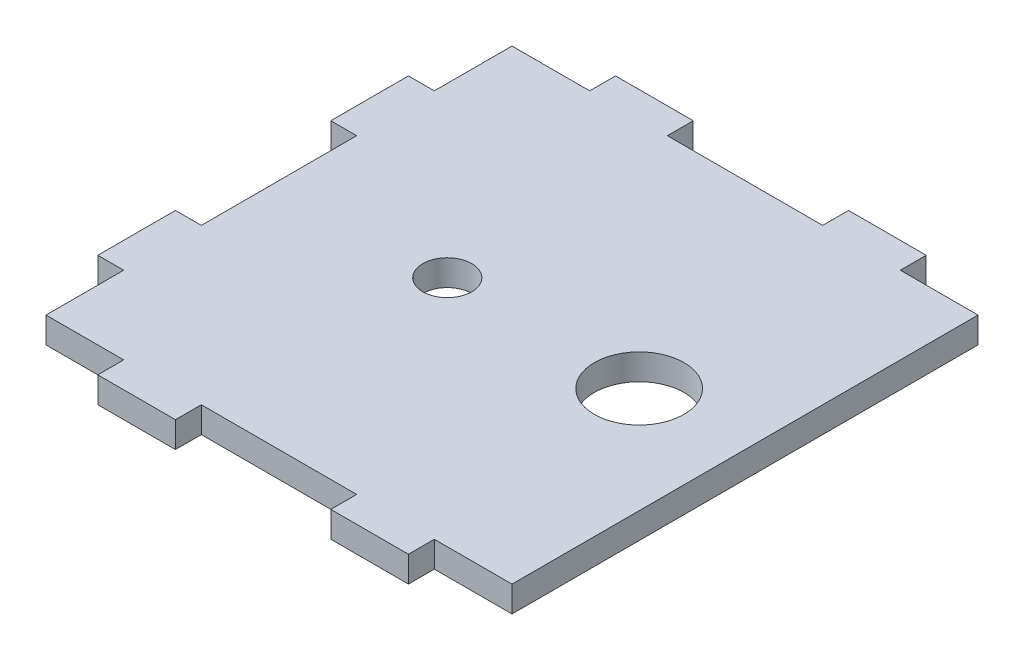
ISO-10303-21;
HEADER;
FILE_DESCRIPTION(('STEP AP214'),'2;1');
FILE_NAME('part.step','',(''),(''),'','','');
FILE_SCHEMA(('AUTOMOTIVE_DESIGN { 1 0 10303 214 1 1 1 1 }'));
ENDSEC;
DATA;
#1=APPLICATION_CONTEXT('core data for automotive mechanical design processes');
#2=APPLICATION_PROTOCOL_DEFINITION('international standard','automotive_design',2000,#1);
#3=PRODUCT_CONTEXT('',#1,'mechanical');
#4=PRODUCT('Part','Part','',(#3));
#5=PRODUCT_RELATED_PRODUCT_CATEGORY('part','',(#4));
#6=PRODUCT_DEFINITION_FORMATION('','',#4);
#7=PRODUCT_DEFINITION_CONTEXT('part definition',#1,'design');
#8=PRODUCT_DEFINITION('design','',#6,#7);
#9=PRODUCT_DEFINITION_SHAPE('','',#8);
#10=(LENGTH_UNIT() NAMED_UNIT(*) SI_UNIT(.MILLI.,.METRE.));
#11=(NAMED_UNIT(*) PLANE_ANGLE_UNIT() SI_UNIT($,.RADIAN.));
#12=(NAMED_UNIT(*) SI_UNIT($,.STERADIAN.) SOLID_ANGLE_UNIT());
#13=UNCERTAINTY_MEASURE_WITH_UNIT(LENGTH_MEASURE(1.E-05),#10,'distance_accuracy_value','');
#14=(GEOMETRIC_REPRESENTATION_CONTEXT(3) GLOBAL_UNCERTAINTY_ASSIGNED_CONTEXT((#13)) GLOBAL_UNIT_ASSIGNED_CONTEXT((#10,
#11,#12)) REPRESENTATION_CONTEXT('',''));
#15=CARTESIAN_POINT('',(0.,0.,0.));
#16=DIRECTION('',(0.,0.,1.));
#17=DIRECTION('',(1.,0.,0.));
#18=AXIS2_PLACEMENT_3D('',#15,#16,#17);
#19=CARTESIAN_POINT('',(0.,-6.35,0.));
#20=DIRECTION('',(-1.,0.,0.));
#21=DIRECTION('',(0.,0.,1.));
#22=AXIS2_PLACEMENT_3D('',#19,#20,#21);
#23=PLANE('',#22);
#24=DIRECTION('',(0.,0.,1.));
#25=VECTOR('',#24,1.);
#26=CARTESIAN_POINT('',(0.,0.,0.));
#27=LINE('',#26,#25);
#28=CARTESIAN_POINT('',(0.,0.,-19.05));
#29=VERTEX_POINT('',#28);
#30=CARTESIAN_POINT('',(0.,0.,0.));
#31=VERTEX_POINT('',#30);
#32=EDGE_CURVE('E262',#29,#31,#27,.T.);
#33=ORIENTED_EDGE('',*,*,#32,.F.);
#34=DIRECTION('',(0.,1.,0.));
#35=VECTOR('',#34,1.);
#36=CARTESIAN_POINT('',(0.,-6.35,-19.05));
#37=LINE('',#36,#35);
#38=CARTESIAN_POINT('',(0.,-6.35,-19.05));
#39=VERTEX_POINT('',#38);
#40=EDGE_CURVE('E11',#39,#29,#37,.T.);
#41=ORIENTED_EDGE('',*,*,#40,.F.);
#42=DIRECTION('',(0.,0.,1.));
#43=VECTOR('',#42,1.);
#44=CARTESIAN_POINT('',(0.,-6.35,0.));
#45=LINE('',#44,#43);
#46=CARTESIAN_POINT('',(0.,-6.35,0.));
#47=VERTEX_POINT('',#46);
#48=EDGE_CURVE('E343',#39,#47,#45,.T.);
#49=ORIENTED_EDGE('',*,*,#48,.T.);
#50=DIRECTION('',(0.,1.,0.));
#51=VECTOR('',#50,1.);
#52=CARTESIAN_POINT('',(0.,-6.35,0.));
#53=LINE('',#52,#51);
#54=EDGE_CURVE('E48',#47,#31,#53,.T.);
#55=ORIENTED_EDGE('',*,*,#54,.T.);
#56=EDGE_LOOP('',(#33,#41,#49,#55));
#57=FACE_BOUND('',#56,.T.);
#58=ADVANCED_FACE('F45',(#57),#23,.T.);
#59=CARTESIAN_POINT('',(0.,-6.35,-19.05));
#60=DIRECTION('',(0.,0.,1.));
#61=DIRECTION('',(1.,0.,0.));
#62=AXIS2_PLACEMENT_3D('',#59,#60,#61);
#63=PLANE('',#62);
#64=DIRECTION('',(1.,0.,0.));
#65=VECTOR('',#64,1.);
#66=CARTESIAN_POINT('',(0.,0.,-19.05));
#67=LINE('',#66,#65);
#68=CARTESIAN_POINT('',(-6.35000000000002,0.,-19.05));
#69=VERTEX_POINT('',#68);
#70=EDGE_CURVE('E341',#69,#29,#67,.T.);
#71=ORIENTED_EDGE('',*,*,#70,.F.);
#72=DIRECTION('',(0.,1.,0.));
#73=VECTOR('',#72,1.);
#74=CARTESIAN_POINT('',(-6.35000000000002,-6.35,-19.05));
#75=LINE('',#74,#73);
#76=CARTESIAN_POINT('',(-6.35000000000002,-6.35,-19.05));
#77=VERTEX_POINT('',#76);
#78=EDGE_CURVE('E54',#77,#69,#75,.T.);
#79=ORIENTED_EDGE('',*,*,#78,.F.);
#80=DIRECTION('',(1.,0.,0.));
#81=VECTOR('',#80,1.);
#82=CARTESIAN_POINT('',(0.,-6.35,-19.05));
#83=LINE('',#82,#81);
#84=EDGE_CURVE('E252',#77,#39,#83,.T.);
#85=ORIENTED_EDGE('',*,*,#84,.T.);
#86=ORIENTED_EDGE('',*,*,#40,.T.);
#87=EDGE_LOOP('',(#71,#79,#85,#86));
#88=FACE_BOUND('',#87,.T.);
#89=ADVANCED_FACE('F395',(#88),#63,.T.);
#90=CARTESIAN_POINT('',(-6.35000000000002,-6.35,-19.05));
#91=DIRECTION('',(-1.,0.,0.));
#92=DIRECTION('',(0.,0.,1.));
#93=AXIS2_PLACEMENT_3D('',#90,#91,#92);
#94=PLANE('',#93);
#95=DIRECTION('',(0.,0.,1.));
#96=VECTOR('',#95,1.);
#97=CARTESIAN_POINT('',(-6.35000000000002,0.,-19.05));
#98=LINE('',#97,#96);
#99=CARTESIAN_POINT('',(-6.35000000000002,0.,-38.1));
#100=VERTEX_POINT('',#99);
#101=EDGE_CURVE('E239',#100,#69,#98,.T.);
#102=ORIENTED_EDGE('',*,*,#101,.F.);
#103=DIRECTION('',(0.,1.,0.));
#104=VECTOR('',#103,1.);
#105=CARTESIAN_POINT('',(-6.35000000000002,-6.35,-38.1));
#106=LINE('',#105,#104);
#107=CARTESIAN_POINT('',(-6.35000000000002,-6.35,-38.1));
#108=VERTEX_POINT('',#107);
#109=EDGE_CURVE('E234',#108,#100,#106,.T.);
#110=ORIENTED_EDGE('',*,*,#109,.F.);
#111=DIRECTION('',(0.,0.,1.));
#112=VECTOR('',#111,1.);
#113=CARTESIAN_POINT('',(-6.35000000000002,-6.35,-19.05));
#114=LINE('',#113,#112);
#115=EDGE_CURVE('E237',#108,#77,#114,.T.);
#116=ORIENTED_EDGE('',*,*,#115,.T.);
#117=ORIENTED_EDGE('',*,*,#78,.T.);
#118=EDGE_LOOP('',(#102,#110,#116,#117));
#119=FACE_BOUND('',#118,.T.);
#120=ADVANCED_FACE('F236',(#119),#94,.T.);
#121=CARTESIAN_POINT('',(0.,-6.35,-38.1));
#122=DIRECTION('',(0.,0.,-1.));
#123=DIRECTION('',(-1.,0.,0.));
#124=AXIS2_PLACEMENT_3D('',#121,#122,#123);
#125=PLANE('',#124);
#126=DIRECTION('',(-1.,0.,0.));
#127=VECTOR('',#126,1.);
#128=CARTESIAN_POINT('',(0.,0.,-38.1));
#129=LINE('',#128,#127);
#130=CARTESIAN_POINT('',(0.,0.,-38.1));
#131=VERTEX_POINT('',#130);
#132=EDGE_CURVE('E338',#131,#100,#129,.T.);
#133=ORIENTED_EDGE('',*,*,#132,.F.);
#134=DIRECTION('',(0.,1.,0.));
#135=VECTOR('',#134,1.);
#136=CARTESIAN_POINT('',(0.,-6.35,-38.1));
#137=LINE('',#136,#135);
#138=CARTESIAN_POINT('',(0.,-6.35,-38.1));
#139=VERTEX_POINT('',#138);
#140=EDGE_CURVE('E244',#139,#131,#137,.T.);
#141=ORIENTED_EDGE('',*,*,#140,.F.);
#142=DIRECTION('',(-1.,0.,0.));
#143=VECTOR('',#142,1.);
#144=CARTESIAN_POINT('',(0.,-6.35,-38.1));
#145=LINE('',#144,#143);
#146=EDGE_CURVE('E250',#139,#108,#145,.T.);
#147=ORIENTED_EDGE('',*,*,#146,.T.);
#148=ORIENTED_EDGE('',*,*,#109,.T.);
#149=EDGE_LOOP('',(#133,#141,#147,#148));
#150=FACE_BOUND('',#149,.T.);
#151=ADVANCED_FACE('F254',(#150),#125,.T.);
#152=CARTESIAN_POINT('',(0.,-6.35,-38.1));
#153=DIRECTION('',(-1.,0.,0.));
#154=DIRECTION('',(0.,0.,1.));
#155=AXIS2_PLACEMENT_3D('',#152,#153,#154);
#156=PLANE('',#155);
#157=DIRECTION('',(0.,0.,1.));
#158=VECTOR('',#157,1.);
#159=CARTESIAN_POINT('',(0.,0.,-38.1));
#160=LINE('',#159,#158);
#161=CARTESIAN_POINT('',(0.,0.,-76.2));
#162=VERTEX_POINT('',#161);
#163=EDGE_CURVE('E335',#162,#131,#160,.T.);
#164=ORIENTED_EDGE('',*,*,#163,.F.);
#165=DIRECTION('',(0.,1.,0.));
#166=VECTOR('',#165,1.);
#167=CARTESIAN_POINT('',(0.,-6.35,-76.2));
#168=LINE('',#167,#166);
#169=CARTESIAN_POINT('',(0.,-6.35,-76.2));
#170=VERTEX_POINT('',#169);
#171=EDGE_CURVE('E347',#170,#162,#168,.T.);
#172=ORIENTED_EDGE('',*,*,#171,.F.);
#173=DIRECTION('',(0.,0.,1.));
#174=VECTOR('',#173,1.);
#175=CARTESIAN_POINT('',(0.,-6.35,-38.1));
#176=LINE('',#175,#174);
#177=EDGE_CURVE('E255',#170,#139,#176,.T.);
#178=ORIENTED_EDGE('',*,*,#177,.T.);
#179=ORIENTED_EDGE('',*,*,#140,.T.);
#180=EDGE_LOOP('',(#164,#172,#178,#179));
#181=FACE_BOUND('',#180,.T.);
#182=ADVANCED_FACE('F408',(#181),#156,.T.);
#183=CARTESIAN_POINT('',(0.,-6.35,-76.2));
#184=DIRECTION('',(0.,0.,1.));
#185=DIRECTION('',(1.,0.,0.));
#186=AXIS2_PLACEMENT_3D('',#183,#184,#185);
#187=PLANE('',#186);
#188=DIRECTION('',(1.,0.,0.));
#189=VECTOR('',#188,1.);
#190=CARTESIAN_POINT('',(0.,0.,-76.2));
#191=LINE('',#190,#189);
#192=CARTESIAN_POINT('',(-6.35000000000002,0.,-76.2));
#193=VERTEX_POINT('',#192);
#194=EDGE_CURVE('E332',#193,#162,#191,.T.);
#195=ORIENTED_EDGE('',*,*,#194,.F.);
#196=DIRECTION('',(0.,1.,0.));
#197=VECTOR('',#196,1.);
#198=CARTESIAN_POINT('',(-6.35000000000002,-6.35,-76.2));
#199=LINE('',#198,#197);
#200=CARTESIAN_POINT('',(-6.35000000000002,-6.35,-76.2));
#201=VERTEX_POINT('',#200);
#202=EDGE_CURVE('E349',#201,#193,#199,.T.);
#203=ORIENTED_EDGE('',*,*,#202,.F.);
#204=DIRECTION('',(1.,0.,0.));
#205=VECTOR('',#204,1.);
#206=CARTESIAN_POINT('',(0.,-6.35,-76.2));
#207=LINE('',#206,#205);
#208=EDGE_CURVE('E257',#201,#170,#207,.T.);
#209=ORIENTED_EDGE('',*,*,#208,.T.);
#210=ORIENTED_EDGE('',*,*,#171,.T.);
#211=EDGE_LOOP('',(#195,#203,#209,#210));
#212=FACE_BOUND('',#211,.T.);
#213=ADVANCED_FACE('F411',(#212),#187,.T.);
#214=CARTESIAN_POINT('',(-6.35000000000002,-6.35,-95.25));
#215=DIRECTION('',(-1.,0.,0.));
#216=DIRECTION('',(0.,0.,1.));
#217=AXIS2_PLACEMENT_3D('',#214,#215,#216);
#218=PLANE('',#217);
#219=DIRECTION('',(0.,0.,1.));
#220=VECTOR('',#219,1.);
#221=CARTESIAN_POINT('',(-6.35000000000002,0.,-95.25));
#222=LINE('',#221,#220);
#223=CARTESIAN_POINT('',(-6.35000000000002,0.,-95.25));
#224=VERTEX_POINT('',#223);
#225=EDGE_CURVE('E329',#224,#193,#222,.T.);
#226=ORIENTED_EDGE('',*,*,#225,.F.);
#227=DIRECTION('',(0.,1.,0.));
#228=VECTOR('',#227,1.);
#229=CARTESIAN_POINT('',(-6.35000000000002,-6.35,-95.25));
#230=LINE('',#229,#228);
#231=CARTESIAN_POINT('',(-6.35000000000002,-6.35,-95.25));
#232=VERTEX_POINT('',#231);
#233=EDGE_CURVE('E351',#232,#224,#230,.T.);
#234=ORIENTED_EDGE('',*,*,#233,.F.);
#235=DIRECTION('',(0.,0.,1.));
#236=VECTOR('',#235,1.);
#237=CARTESIAN_POINT('',(-6.35000000000002,-6.35,-95.25));
#238=LINE('',#237,#236);
#239=EDGE_CURVE('E597',#232,#201,#238,.T.);
#240=ORIENTED_EDGE('',*,*,#239,.T.);
#241=ORIENTED_EDGE('',*,*,#202,.T.);
#242=EDGE_LOOP('',(#226,#234,#240,#241));
#243=FACE_BOUND('',#242,.T.);
#244=ADVANCED_FACE('F415',(#243),#218,.T.);
#245=CARTESIAN_POINT('',(0.,-6.35,-95.25));
#246=DIRECTION('',(0.,0.,-1.));
#247=DIRECTION('',(-1.,0.,0.));
#248=AXIS2_PLACEMENT_3D('',#245,#246,#247);
#249=PLANE('',#248);
#250=DIRECTION('',(-1.,0.,0.));
#251=VECTOR('',#250,1.);
#252=CARTESIAN_POINT('',(0.,0.,-95.25));
#253=LINE('',#252,#251);
#254=CARTESIAN_POINT('',(0.,0.,-95.25));
#255=VERTEX_POINT('',#254);
#256=EDGE_CURVE('E326',#255,#224,#253,.T.);
#257=ORIENTED_EDGE('',*,*,#256,.F.);
#258=DIRECTION('',(0.,1.,0.));
#259=VECTOR('',#258,1.);
#260=CARTESIAN_POINT('',(0.,-6.35,-95.25));
#261=LINE('',#260,#259);
#262=CARTESIAN_POINT('',(0.,-6.35,-95.25));
#263=VERTEX_POINT('',#262);
#264=EDGE_CURVE('E353',#263,#255,#261,.T.);
#265=ORIENTED_EDGE('',*,*,#264,.F.);
#266=DIRECTION('',(-1.,0.,0.));
#267=VECTOR('',#266,1.);
#268=CARTESIAN_POINT('',(0.,-6.35,-95.25));
#269=LINE('',#268,#267);
#270=EDGE_CURVE('E594',#263,#232,#269,.T.);
#271=ORIENTED_EDGE('',*,*,#270,.T.);
#272=ORIENTED_EDGE('',*,*,#233,.T.);
#273=EDGE_LOOP('',(#257,#265,#271,#272));
#274=FACE_BOUND('',#273,.T.);
#275=ADVANCED_FACE('F419',(#274),#249,.T.);
#276=CARTESIAN_POINT('',(0.,-6.35,-95.25));
#277=DIRECTION('',(-1.,0.,0.));
#278=DIRECTION('',(0.,0.,1.));
#279=AXIS2_PLACEMENT_3D('',#276,#277,#278);
#280=PLANE('',#279);
#281=DIRECTION('',(0.,0.,1.));
#282=VECTOR('',#281,1.);
#283=CARTESIAN_POINT('',(0.,0.,-95.25));
#284=LINE('',#283,#282);
#285=CARTESIAN_POINT('',(0.,0.,-114.3));
#286=VERTEX_POINT('',#285);
#287=EDGE_CURVE('E323',#286,#255,#284,.T.);
#288=ORIENTED_EDGE('',*,*,#287,.F.);
#289=DIRECTION('',(0.,1.,0.));
#290=VECTOR('',#289,1.);
#291=CARTESIAN_POINT('',(0.,-6.35,-114.3));
#292=LINE('',#291,#290);
#293=CARTESIAN_POINT('',(0.,-6.35,-114.3));
#294=VERTEX_POINT('',#293);
#295=EDGE_CURVE('E355',#294,#286,#292,.T.);
#296=ORIENTED_EDGE('',*,*,#295,.F.);
#297=DIRECTION('',(0.,0.,1.));
#298=VECTOR('',#297,1.);
#299=CARTESIAN_POINT('',(0.,-6.35,-95.25));
#300=LINE('',#299,#298);
#301=EDGE_CURVE('E591',#294,#263,#300,.T.);
#302=ORIENTED_EDGE('',*,*,#301,.T.);
#303=ORIENTED_EDGE('',*,*,#264,.T.);
#304=EDGE_LOOP('',(#288,#296,#302,#303));
#305=FACE_BOUND('',#304,.T.);
#306=ADVANCED_FACE('F423',(#305),#280,.T.);
#307=CARTESIAN_POINT('',(0.,-6.35,-114.3));
#308=DIRECTION('',(0.,0.,-1.));
#309=DIRECTION('',(-1.,0.,0.));
#310=AXIS2_PLACEMENT_3D('',#307,#308,#309);
#311=PLANE('',#310);
#312=DIRECTION('',(-1.,0.,0.));
#313=VECTOR('',#312,1.);
#314=CARTESIAN_POINT('',(0.,0.,-114.3));
#315=LINE('',#314,#313);
#316=CARTESIAN_POINT('',(19.05,0.,-114.3));
#317=VERTEX_POINT('',#316);
#318=EDGE_CURVE('E320',#317,#286,#315,.T.);
#319=ORIENTED_EDGE('',*,*,#318,.F.);
#320=DIRECTION('',(0.,1.,0.));
#321=VECTOR('',#320,1.);
#322=CARTESIAN_POINT('',(19.05,-6.35,-114.3));
#323=LINE('',#322,#321);
#324=CARTESIAN_POINT('',(19.05,-6.35,-114.3));
#325=VERTEX_POINT('',#324);
#326=EDGE_CURVE('E357',#325,#317,#323,.T.);
#327=ORIENTED_EDGE('',*,*,#326,.F.);
#328=DIRECTION('',(-1.,0.,0.));
#329=VECTOR('',#328,1.);
#330=CARTESIAN_POINT('',(0.,-6.35,-114.3));
#331=LINE('',#330,#329);
#332=EDGE_CURVE('E588',#325,#294,#331,.T.);
#333=ORIENTED_EDGE('',*,*,#332,.T.);
#334=ORIENTED_EDGE('',*,*,#295,.T.);
#335=EDGE_LOOP('',(#319,#327,#333,#334));
#336=FACE_BOUND('',#335,.T.);
#337=ADVANCED_FACE('F427',(#336),#311,.T.);
#338=CARTESIAN_POINT('',(19.05,-6.35,-114.3));
#339=DIRECTION('',(-1.,0.,0.));
#340=DIRECTION('',(0.,0.,1.));
#341=AXIS2_PLACEMENT_3D('',#338,#339,#340);
#342=PLANE('',#341);
#343=DIRECTION('',(0.,0.,1.));
#344=VECTOR('',#343,1.);
#345=CARTESIAN_POINT('',(19.05,0.,-114.3));
#346=LINE('',#345,#344);
#347=CARTESIAN_POINT('',(19.05,0.,-120.65));
#348=VERTEX_POINT('',#347);
#349=EDGE_CURVE('E317',#348,#317,#346,.T.);
#350=ORIENTED_EDGE('',*,*,#349,.F.);
#351=DIRECTION('',(0.,1.,0.));
#352=VECTOR('',#351,1.);
#353=CARTESIAN_POINT('',(19.05,-6.35,-120.65));
#354=LINE('',#353,#352);
#355=CARTESIAN_POINT('',(19.05,-6.35,-120.65));
#356=VERTEX_POINT('',#355);
#357=EDGE_CURVE('E359',#356,#348,#354,.T.);
#358=ORIENTED_EDGE('',*,*,#357,.F.);
#359=DIRECTION('',(0.,0.,1.));
#360=VECTOR('',#359,1.);
#361=CARTESIAN_POINT('',(19.05,-6.35,-114.3));
#362=LINE('',#361,#360);
#363=EDGE_CURVE('E585',#356,#325,#362,.T.);
#364=ORIENTED_EDGE('',*,*,#363,.T.);
#365=ORIENTED_EDGE('',*,*,#326,.T.);
#366=EDGE_LOOP('',(#350,#358,#364,#365));
#367=FACE_BOUND('',#366,.T.);
#368=ADVANCED_FACE('F431',(#367),#342,.T.);
#369=CARTESIAN_POINT('',(19.05,-6.35,-120.65));
#370=DIRECTION('',(0.,0.,-1.));
#371=DIRECTION('',(-1.,0.,0.));
#372=AXIS2_PLACEMENT_3D('',#369,#370,#371);
#373=PLANE('',#372);
#374=DIRECTION('',(-1.,0.,0.));
#375=VECTOR('',#374,1.);
#376=CARTESIAN_POINT('',(19.05,0.,-120.65));
#377=LINE('',#376,#375);
#378=CARTESIAN_POINT('',(38.1,0.,-120.65));
#379=VERTEX_POINT('',#378);
#380=EDGE_CURVE('E314',#379,#348,#377,.T.);
#381=ORIENTED_EDGE('',*,*,#380,.F.);
#382=DIRECTION('',(0.,1.,0.));
#383=VECTOR('',#382,1.);
#384=CARTESIAN_POINT('',(38.1,-6.35,-120.65));
#385=LINE('',#384,#383);
#386=CARTESIAN_POINT('',(38.1,-6.35,-120.65));
#387=VERTEX_POINT('',#386);
#388=EDGE_CURVE('E361',#387,#379,#385,.T.);
#389=ORIENTED_EDGE('',*,*,#388,.F.);
#390=DIRECTION('',(-1.,0.,0.));
#391=VECTOR('',#390,1.);
#392=CARTESIAN_POINT('',(19.05,-6.35,-120.65));
#393=LINE('',#392,#391);
#394=EDGE_CURVE('E582',#387,#356,#393,.T.);
#395=ORIENTED_EDGE('',*,*,#394,.T.);
#396=ORIENTED_EDGE('',*,*,#357,.T.);
#397=EDGE_LOOP('',(#381,#389,#395,#396));
#398=FACE_BOUND('',#397,.T.);
#399=ADVANCED_FACE('F435',(#398),#373,.T.);
#400=CARTESIAN_POINT('',(38.1,-6.35,-114.3));
#401=DIRECTION('',(1.,0.,0.));
#402=DIRECTION('',(0.,0.,-1.));
#403=AXIS2_PLACEMENT_3D('',#400,#401,#402);
#404=PLANE('',#403);
#405=DIRECTION('',(0.,0.,-1.));
#406=VECTOR('',#405,1.);
#407=CARTESIAN_POINT('',(38.1,0.,-114.3));
#408=LINE('',#407,#406);
#409=CARTESIAN_POINT('',(38.1,0.,-114.3));
#410=VERTEX_POINT('',#409);
#411=EDGE_CURVE('E311',#410,#379,#408,.T.);
#412=ORIENTED_EDGE('',*,*,#411,.F.);
#413=DIRECTION('',(0.,1.,0.));
#414=VECTOR('',#413,1.);
#415=CARTESIAN_POINT('',(38.1,-6.35,-114.3));
#416=LINE('',#415,#414);
#417=CARTESIAN_POINT('',(38.1,-6.35,-114.3));
#418=VERTEX_POINT('',#417);
#419=EDGE_CURVE('E363',#418,#410,#416,.T.);
#420=ORIENTED_EDGE('',*,*,#419,.F.);
#421=DIRECTION('',(0.,0.,-1.));
#422=VECTOR('',#421,1.);
#423=CARTESIAN_POINT('',(38.1,-6.35,-114.3));
#424=LINE('',#423,#422);
#425=EDGE_CURVE('E579',#418,#387,#424,.T.);
#426=ORIENTED_EDGE('',*,*,#425,.T.);
#427=ORIENTED_EDGE('',*,*,#388,.T.);
#428=EDGE_LOOP('',(#412,#420,#426,#427));
#429=FACE_BOUND('',#428,.T.);
#430=ADVANCED_FACE('F439',(#429),#404,.T.);
#431=CARTESIAN_POINT('',(38.1,-6.35,-114.3));
#432=DIRECTION('',(0.,0.,-1.));
#433=DIRECTION('',(-1.,0.,0.));
#434=AXIS2_PLACEMENT_3D('',#431,#432,#433);
#435=PLANE('',#434);
#436=DIRECTION('',(-1.,0.,0.));
#437=VECTOR('',#436,1.);
#438=CARTESIAN_POINT('',(38.1,0.,-114.3));
#439=LINE('',#438,#437);
#440=CARTESIAN_POINT('',(76.2,0.,-114.3));
#441=VERTEX_POINT('',#440);
#442=EDGE_CURVE('E308',#441,#410,#439,.T.);
#443=ORIENTED_EDGE('',*,*,#442,.F.);
#444=DIRECTION('',(0.,1.,0.));
#445=VECTOR('',#444,1.);
#446=CARTESIAN_POINT('',(76.2,-6.35,-114.3));
#447=LINE('',#446,#445);
#448=CARTESIAN_POINT('',(76.2,-6.35,-114.3));
#449=VERTEX_POINT('',#448);
#450=EDGE_CURVE('E365',#449,#441,#447,.T.);
#451=ORIENTED_EDGE('',*,*,#450,.F.);
#452=DIRECTION('',(-1.,0.,0.));
#453=VECTOR('',#452,1.);
#454=CARTESIAN_POINT('',(38.1,-6.35,-114.3));
#455=LINE('',#454,#453);
#456=EDGE_CURVE('E576',#449,#418,#455,.T.);
#457=ORIENTED_EDGE('',*,*,#456,.T.);
#458=ORIENTED_EDGE('',*,*,#419,.T.);
#459=EDGE_LOOP('',(#443,#451,#457,#458));
#460=FACE_BOUND('',#459,.T.);
#461=ADVANCED_FACE('F443',(#460),#435,.T.);
#462=CARTESIAN_POINT('',(76.2,-6.35,-114.3));
#463=DIRECTION('',(-1.,0.,0.));
#464=DIRECTION('',(0.,0.,1.));
#465=AXIS2_PLACEMENT_3D('',#462,#463,#464);
#466=PLANE('',#465);
#467=DIRECTION('',(0.,0.,1.));
#468=VECTOR('',#467,1.);
#469=CARTESIAN_POINT('',(76.2,0.,-114.3));
#470=LINE('',#469,#468);
#471=CARTESIAN_POINT('',(76.2,0.,-120.65));
#472=VERTEX_POINT('',#471);
#473=EDGE_CURVE('E305',#472,#441,#470,.T.);
#474=ORIENTED_EDGE('',*,*,#473,.F.);
#475=DIRECTION('',(0.,1.,0.));
#476=VECTOR('',#475,1.);
#477=CARTESIAN_POINT('',(76.2,-6.35,-120.65));
#478=LINE('',#477,#476);
#479=CARTESIAN_POINT('',(76.2,-6.35,-120.65));
#480=VERTEX_POINT('',#479);
#481=EDGE_CURVE('E367',#480,#472,#478,.T.);
#482=ORIENTED_EDGE('',*,*,#481,.F.);
#483=DIRECTION('',(0.,0.,1.));
#484=VECTOR('',#483,1.);
#485=CARTESIAN_POINT('',(76.2,-6.35,-114.3));
#486=LINE('',#485,#484);
#487=EDGE_CURVE('E573',#480,#449,#486,.T.);
#488=ORIENTED_EDGE('',*,*,#487,.T.);
#489=ORIENTED_EDGE('',*,*,#450,.T.);
#490=EDGE_LOOP('',(#474,#482,#488,#489));
#491=FACE_BOUND('',#490,.T.);
#492=ADVANCED_FACE('F447',(#491),#466,.T.);
#493=CARTESIAN_POINT('',(95.25,-6.35,-120.65));
#494=DIRECTION('',(0.,0.,-1.));
#495=DIRECTION('',(-1.,0.,0.));
#496=AXIS2_PLACEMENT_3D('',#493,#494,#495);
#497=PLANE('',#496);
#498=DIRECTION('',(-1.,0.,0.));
#499=VECTOR('',#498,1.);
#500=CARTESIAN_POINT('',(95.25,0.,-120.65));
#501=LINE('',#500,#499);
#502=CARTESIAN_POINT('',(95.25,0.,-120.65));
#503=VERTEX_POINT('',#502);
#504=EDGE_CURVE('E302',#503,#472,#501,.T.);
#505=ORIENTED_EDGE('',*,*,#504,.F.);
#506=DIRECTION('',(0.,1.,0.));
#507=VECTOR('',#506,1.);
#508=CARTESIAN_POINT('',(95.25,-6.35,-120.65));
#509=LINE('',#508,#507);
#510=CARTESIAN_POINT('',(95.25,-6.35,-120.65));
#511=VERTEX_POINT('',#510);
#512=EDGE_CURVE('E369',#511,#503,#509,.T.);
#513=ORIENTED_EDGE('',*,*,#512,.F.);
#514=DIRECTION('',(-1.,0.,0.));
#515=VECTOR('',#514,1.);
#516=CARTESIAN_POINT('',(95.25,-6.35,-120.65));
#517=LINE('',#516,#515);
#518=EDGE_CURVE('E570',#511,#480,#517,.T.);
#519=ORIENTED_EDGE('',*,*,#518,.T.);
#520=ORIENTED_EDGE('',*,*,#481,.T.);
#521=EDGE_LOOP('',(#505,#513,#519,#520));
#522=FACE_BOUND('',#521,.T.);
#523=ADVANCED_FACE('F451',(#522),#497,.T.);
#524=CARTESIAN_POINT('',(95.25,-6.35,-114.3));
#525=DIRECTION('',(1.,0.,0.));
#526=DIRECTION('',(0.,0.,-1.));
#527=AXIS2_PLACEMENT_3D('',#524,#525,#526);
#528=PLANE('',#527);
#529=DIRECTION('',(0.,0.,-1.));
#530=VECTOR('',#529,1.);
#531=CARTESIAN_POINT('',(95.25,0.,-114.3));
#532=LINE('',#531,#530);
#533=CARTESIAN_POINT('',(95.25,0.,-114.3));
#534=VERTEX_POINT('',#533);
#535=EDGE_CURVE('E299',#534,#503,#532,.T.);
#536=ORIENTED_EDGE('',*,*,#535,.F.);
#537=DIRECTION('',(0.,1.,0.));
#538=VECTOR('',#537,1.);
#539=CARTESIAN_POINT('',(95.25,-6.35,-114.3));
#540=LINE('',#539,#538);
#541=CARTESIAN_POINT('',(95.25,-6.35,-114.3));
#542=VERTEX_POINT('',#541);
#543=EDGE_CURVE('E371',#542,#534,#540,.T.);
#544=ORIENTED_EDGE('',*,*,#543,.F.);
#545=DIRECTION('',(0.,0.,-1.));
#546=VECTOR('',#545,1.);
#547=CARTESIAN_POINT('',(95.25,-6.35,-114.3));
#548=LINE('',#547,#546);
#549=EDGE_CURVE('E567',#542,#511,#548,.T.);
#550=ORIENTED_EDGE('',*,*,#549,.T.);
#551=ORIENTED_EDGE('',*,*,#512,.T.);
#552=EDGE_LOOP('',(#536,#544,#550,#551));
#553=FACE_BOUND('',#552,.T.);
#554=ADVANCED_FACE('F455',(#553),#528,.T.);
#555=CARTESIAN_POINT('',(95.25,-6.35,-114.3));
#556=DIRECTION('',(0.,0.,-1.));
#557=DIRECTION('',(-1.,0.,0.));
#558=AXIS2_PLACEMENT_3D('',#555,#556,#557);
#559=PLANE('',#558);
#560=DIRECTION('',(-1.,0.,0.));
#561=VECTOR('',#560,1.);
#562=CARTESIAN_POINT('',(95.25,0.,-114.3));
#563=LINE('',#562,#561);
#564=CARTESIAN_POINT('',(114.3,0.,-114.3));
#565=VERTEX_POINT('',#564);
#566=EDGE_CURVE('E296',#565,#534,#563,.T.);
#567=ORIENTED_EDGE('',*,*,#566,.F.);
#568=DIRECTION('',(0.,1.,0.));
#569=VECTOR('',#568,1.);
#570=CARTESIAN_POINT('',(114.3,-6.35,-114.3));
#571=LINE('',#570,#569);
#572=CARTESIAN_POINT('',(114.3,-6.35,-114.3));
#573=VERTEX_POINT('',#572);
#574=EDGE_CURVE('E373',#573,#565,#571,.T.);
#575=ORIENTED_EDGE('',*,*,#574,.F.);
#576=DIRECTION('',(-1.,0.,0.));
#577=VECTOR('',#576,1.);
#578=CARTESIAN_POINT('',(95.25,-6.35,-114.3));
#579=LINE('',#578,#577);
#580=EDGE_CURVE('E564',#573,#542,#579,.T.);
#581=ORIENTED_EDGE('',*,*,#580,.T.);
#582=ORIENTED_EDGE('',*,*,#543,.T.);
#583=EDGE_LOOP('',(#567,#575,#581,#582));
#584=FACE_BOUND('',#583,.T.);
#585=ADVANCED_FACE('F459',(#584),#559,.T.);
#586=CARTESIAN_POINT('',(114.3,-6.35,0.));
#587=DIRECTION('',(1.,0.,0.));
#588=DIRECTION('',(0.,0.,-1.));
#589=AXIS2_PLACEMENT_3D('',#586,#587,#588);
#590=PLANE('',#589);
#591=DIRECTION('',(0.,0.,-1.));
#592=VECTOR('',#591,1.);
#593=CARTESIAN_POINT('',(114.3,0.,0.));
#594=LINE('',#593,#592);
#595=CARTESIAN_POINT('',(114.3,0.,0.));
#596=VERTEX_POINT('',#595);
#597=EDGE_CURVE('E293',#596,#565,#594,.T.);
#598=ORIENTED_EDGE('',*,*,#597,.F.);
#599=DIRECTION('',(0.,1.,0.));
#600=VECTOR('',#599,1.);
#601=CARTESIAN_POINT('',(114.3,-6.35,0.));
#602=LINE('',#601,#600);
#603=CARTESIAN_POINT('',(114.3,-6.35,0.));
#604=VERTEX_POINT('',#603);
#605=EDGE_CURVE('E375',#604,#596,#602,.T.);
#606=ORIENTED_EDGE('',*,*,#605,.F.);
#607=DIRECTION('',(0.,0.,-1.));
#608=VECTOR('',#607,1.);
#609=CARTESIAN_POINT('',(114.3,-6.35,0.));
#610=LINE('',#609,#608);
#611=EDGE_CURVE('E561',#604,#573,#610,.T.);
#612=ORIENTED_EDGE('',*,*,#611,.T.);
#613=ORIENTED_EDGE('',*,*,#574,.T.);
#614=EDGE_LOOP('',(#598,#606,#612,#613));
#615=FACE_BOUND('',#614,.T.);
#616=ADVANCED_FACE('F463',(#615),#590,.T.);
#617=CARTESIAN_POINT('',(95.25,-6.35,0.));
#618=DIRECTION('',(0.,0.,1.));
#619=DIRECTION('',(1.,0.,0.));
#620=AXIS2_PLACEMENT_3D('',#617,#618,#619);
#621=PLANE('',#620);
#622=DIRECTION('',(1.,0.,0.));
#623=VECTOR('',#622,1.);
#624=CARTESIAN_POINT('',(95.25,0.,0.));
#625=LINE('',#624,#623);
#626=CARTESIAN_POINT('',(95.25,0.,0.));
#627=VERTEX_POINT('',#626);
#628=EDGE_CURVE('E290',#627,#596,#625,.T.);
#629=ORIENTED_EDGE('',*,*,#628,.F.);
#630=DIRECTION('',(0.,1.,0.));
#631=VECTOR('',#630,1.);
#632=CARTESIAN_POINT('',(95.25,-6.35,0.));
#633=LINE('',#632,#631);
#634=CARTESIAN_POINT('',(95.25,-6.35,0.));
#635=VERTEX_POINT('',#634);
#636=EDGE_CURVE('E377',#635,#627,#633,.T.);
#637=ORIENTED_EDGE('',*,*,#636,.F.);
#638=DIRECTION('',(1.,0.,0.));
#639=VECTOR('',#638,1.);
#640=CARTESIAN_POINT('',(95.25,-6.35,0.));
#641=LINE('',#640,#639);
#642=EDGE_CURVE('E558',#635,#604,#641,.T.);
#643=ORIENTED_EDGE('',*,*,#642,.T.);
#644=ORIENTED_EDGE('',*,*,#605,.T.);
#645=EDGE_LOOP('',(#629,#637,#643,#644));
#646=FACE_BOUND('',#645,.T.);
#647=ADVANCED_FACE('F467',(#646),#621,.T.);
#648=CARTESIAN_POINT('',(95.25,-6.35,0.));
#649=DIRECTION('',(1.,0.,0.));
#650=DIRECTION('',(0.,0.,-1.));
#651=AXIS2_PLACEMENT_3D('',#648,#649,#650);
#652=PLANE('',#651);
#653=DIRECTION('',(0.,0.,-1.));
#654=VECTOR('',#653,1.);
#655=CARTESIAN_POINT('',(95.25,0.,0.));
#656=LINE('',#655,#654);
#657=CARTESIAN_POINT('',(95.25,0.,6.34999999999999));
#658=VERTEX_POINT('',#657);
#659=EDGE_CURVE('E287',#658,#627,#656,.T.);
#660=ORIENTED_EDGE('',*,*,#659,.F.);
#661=DIRECTION('',(0.,1.,0.));
#662=VECTOR('',#661,1.);
#663=CARTESIAN_POINT('',(95.25,-6.35,6.34999999999999));
#664=LINE('',#663,#662);
#665=CARTESIAN_POINT('',(95.25,-6.35,6.34999999999999));
#666=VERTEX_POINT('',#665);
#667=EDGE_CURVE('E379',#666,#658,#664,.T.);
#668=ORIENTED_EDGE('',*,*,#667,.F.);
#669=DIRECTION('',(0.,0.,-1.));
#670=VECTOR('',#669,1.);
#671=CARTESIAN_POINT('',(95.25,-6.35,0.));
#672=LINE('',#671,#670);
#673=EDGE_CURVE('E555',#666,#635,#672,.T.);
#674=ORIENTED_EDGE('',*,*,#673,.T.);
#675=ORIENTED_EDGE('',*,*,#636,.T.);
#676=EDGE_LOOP('',(#660,#668,#674,#675));
#677=FACE_BOUND('',#676,.T.);
#678=ADVANCED_FACE('F471',(#677),#652,.T.);
#679=CARTESIAN_POINT('',(95.25,-6.35,6.34999999999999));
#680=DIRECTION('',(0.,0.,1.));
#681=DIRECTION('',(1.,0.,0.));
#682=AXIS2_PLACEMENT_3D('',#679,#680,#681);
#683=PLANE('',#682);
#684=DIRECTION('',(1.,0.,0.));
#685=VECTOR('',#684,1.);
#686=CARTESIAN_POINT('',(95.25,0.,6.34999999999999));
#687=LINE('',#686,#685);
#688=CARTESIAN_POINT('',(76.2,0.,6.35));
#689=VERTEX_POINT('',#688);
#690=EDGE_CURVE('E284',#689,#658,#687,.T.);
#691=ORIENTED_EDGE('',*,*,#690,.F.);
#692=DIRECTION('',(0.,1.,0.));
#693=VECTOR('',#692,1.);
#694=CARTESIAN_POINT('',(76.2,-6.35,6.35));
#695=LINE('',#694,#693);
#696=CARTESIAN_POINT('',(76.2,-6.35,6.35));
#697=VERTEX_POINT('',#696);
#698=EDGE_CURVE('E381',#697,#689,#695,.T.);
#699=ORIENTED_EDGE('',*,*,#698,.F.);
#700=DIRECTION('',(1.,0.,0.));
#701=VECTOR('',#700,1.);
#702=CARTESIAN_POINT('',(95.25,-6.35,6.34999999999999));
#703=LINE('',#702,#701);
#704=EDGE_CURVE('E552',#697,#666,#703,.T.);
#705=ORIENTED_EDGE('',*,*,#704,.T.);
#706=ORIENTED_EDGE('',*,*,#667,.T.);
#707=EDGE_LOOP('',(#691,#699,#705,#706));
#708=FACE_BOUND('',#707,.T.);
#709=ADVANCED_FACE('F475',(#708),#683,.T.);
#710=CARTESIAN_POINT('',(76.2,-6.35,0.));
#711=DIRECTION('',(-1.,0.,0.));
#712=DIRECTION('',(0.,0.,1.));
#713=AXIS2_PLACEMENT_3D('',#710,#711,#712);
#714=PLANE('',#713);
#715=DIRECTION('',(0.,0.,1.));
#716=VECTOR('',#715,1.);
#717=CARTESIAN_POINT('',(76.2,0.,0.));
#718=LINE('',#717,#716);
#719=CARTESIAN_POINT('',(76.2,0.,0.));
#720=VERTEX_POINT('',#719);
#721=EDGE_CURVE('E281',#720,#689,#718,.T.);
#722=ORIENTED_EDGE('',*,*,#721,.F.);
#723=DIRECTION('',(0.,1.,0.));
#724=VECTOR('',#723,1.);
#725=CARTESIAN_POINT('',(76.2,-6.35,0.));
#726=LINE('',#725,#724);
#727=CARTESIAN_POINT('',(76.2,-6.35,0.));
#728=VERTEX_POINT('',#727);
#729=EDGE_CURVE('E383',#728,#720,#726,.T.);
#730=ORIENTED_EDGE('',*,*,#729,.F.);
#731=DIRECTION('',(0.,0.,1.));
#732=VECTOR('',#731,1.);
#733=CARTESIAN_POINT('',(76.2,-6.35,0.));
#734=LINE('',#733,#732);
#735=EDGE_CURVE('E549',#728,#697,#734,.T.);
#736=ORIENTED_EDGE('',*,*,#735,.T.);
#737=ORIENTED_EDGE('',*,*,#698,.T.);
#738=EDGE_LOOP('',(#722,#730,#736,#737));
#739=FACE_BOUND('',#738,.T.);
#740=ADVANCED_FACE('F479',(#739),#714,.T.);
#741=CARTESIAN_POINT('',(38.1,-6.35,0.));
#742=DIRECTION('',(0.,0.,1.));
#743=DIRECTION('',(1.,0.,0.));
#744=AXIS2_PLACEMENT_3D('',#741,#742,#743);
#745=PLANE('',#744);
#746=DIRECTION('',(1.,0.,0.));
#747=VECTOR('',#746,1.);
#748=CARTESIAN_POINT('',(38.1,0.,0.));
#749=LINE('',#748,#747);
#750=CARTESIAN_POINT('',(38.1,0.,0.));
#751=VERTEX_POINT('',#750);
#752=EDGE_CURVE('E278',#751,#720,#749,.T.);
#753=ORIENTED_EDGE('',*,*,#752,.F.);
#754=DIRECTION('',(0.,1.,0.));
#755=VECTOR('',#754,1.);
#756=CARTESIAN_POINT('',(38.1,-6.35,0.));
#757=LINE('',#756,#755);
#758=CARTESIAN_POINT('',(38.1,-6.35,0.));
#759=VERTEX_POINT('',#758);
#760=EDGE_CURVE('E385',#759,#751,#757,.T.);
#761=ORIENTED_EDGE('',*,*,#760,.F.);
#762=DIRECTION('',(1.,0.,0.));
#763=VECTOR('',#762,1.);
#764=CARTESIAN_POINT('',(38.1,-6.35,0.));
#765=LINE('',#764,#763);
#766=EDGE_CURVE('E546',#759,#728,#765,.T.);
#767=ORIENTED_EDGE('',*,*,#766,.T.);
#768=ORIENTED_EDGE('',*,*,#729,.T.);
#769=EDGE_LOOP('',(#753,#761,#767,#768));
#770=FACE_BOUND('',#769,.T.);
#771=ADVANCED_FACE('F483',(#770),#745,.T.);
#772=CARTESIAN_POINT('',(38.1,-6.35,0.));
#773=DIRECTION('',(1.,0.,0.));
#774=DIRECTION('',(0.,0.,-1.));
#775=AXIS2_PLACEMENT_3D('',#772,#773,#774);
#776=PLANE('',#775);
#777=DIRECTION('',(0.,0.,-1.));
#778=VECTOR('',#777,1.);
#779=CARTESIAN_POINT('',(38.1,0.,0.));
#780=LINE('',#779,#778);
#781=CARTESIAN_POINT('',(38.1,0.,6.34999999999999));
#782=VERTEX_POINT('',#781);
#783=EDGE_CURVE('E275',#782,#751,#780,.T.);
#784=ORIENTED_EDGE('',*,*,#783,.F.);
#785=DIRECTION('',(0.,1.,0.));
#786=VECTOR('',#785,1.);
#787=CARTESIAN_POINT('',(38.1,-6.35,6.34999999999999));
#788=LINE('',#787,#786);
#789=CARTESIAN_POINT('',(38.1,-6.35,6.34999999999999));
#790=VERTEX_POINT('',#789);
#791=EDGE_CURVE('E387',#790,#782,#788,.T.);
#792=ORIENTED_EDGE('',*,*,#791,.F.);
#793=DIRECTION('',(0.,0.,-1.));
#794=VECTOR('',#793,1.);
#795=CARTESIAN_POINT('',(38.1,-6.35,0.));
#796=LINE('',#795,#794);
#797=EDGE_CURVE('E543',#790,#759,#796,.T.);
#798=ORIENTED_EDGE('',*,*,#797,.T.);
#799=ORIENTED_EDGE('',*,*,#760,.T.);
#800=EDGE_LOOP('',(#784,#792,#798,#799));
#801=FACE_BOUND('',#800,.T.);
#802=ADVANCED_FACE('F487',(#801),#776,.T.);
#803=CARTESIAN_POINT('',(19.05,-6.35,6.34999999999999));
#804=DIRECTION('',(0.,0.,1.));
#805=DIRECTION('',(1.,0.,0.));
#806=AXIS2_PLACEMENT_3D('',#803,#804,#805);
#807=PLANE('',#806);
#808=DIRECTION('',(1.,0.,0.));
#809=VECTOR('',#808,1.);
#810=CARTESIAN_POINT('',(19.05,0.,6.34999999999999));
#811=LINE('',#810,#809);
#812=CARTESIAN_POINT('',(19.05,0.,6.34999999999999));
#813=VERTEX_POINT('',#812);
#814=EDGE_CURVE('E272',#813,#782,#811,.T.);
#815=ORIENTED_EDGE('',*,*,#814,.F.);
#816=DIRECTION('',(0.,1.,0.));
#817=VECTOR('',#816,1.);
#818=CARTESIAN_POINT('',(19.05,-6.35,6.34999999999999));
#819=LINE('',#818,#817);
#820=CARTESIAN_POINT('',(19.05,-6.35,6.34999999999999));
#821=VERTEX_POINT('',#820);
#822=EDGE_CURVE('E389',#821,#813,#819,.T.);
#823=ORIENTED_EDGE('',*,*,#822,.F.);
#824=DIRECTION('',(1.,0.,0.));
#825=VECTOR('',#824,1.);
#826=CARTESIAN_POINT('',(19.05,-6.35,6.34999999999999));
#827=LINE('',#826,#825);
#828=EDGE_CURVE('E540',#821,#790,#827,.T.);
#829=ORIENTED_EDGE('',*,*,#828,.T.);
#830=ORIENTED_EDGE('',*,*,#791,.T.);
#831=EDGE_LOOP('',(#815,#823,#829,#830));
#832=FACE_BOUND('',#831,.T.);
#833=ADVANCED_FACE('F491',(#832),#807,.T.);
#834=CARTESIAN_POINT('',(19.05,-6.35,0.));
#835=DIRECTION('',(-1.,0.,0.));
#836=DIRECTION('',(0.,0.,1.));
#837=AXIS2_PLACEMENT_3D('',#834,#835,#836);
#838=PLANE('',#837);
#839=DIRECTION('',(0.,0.,1.));
#840=VECTOR('',#839,1.);
#841=CARTESIAN_POINT('',(19.05,0.,0.));
#842=LINE('',#841,#840);
#843=CARTESIAN_POINT('',(19.05,0.,0.));
#844=VERTEX_POINT('',#843);
#845=EDGE_CURVE('E269',#844,#813,#842,.T.);
#846=ORIENTED_EDGE('',*,*,#845,.F.);
#847=DIRECTION('',(0.,1.,0.));
#848=VECTOR('',#847,1.);
#849=CARTESIAN_POINT('',(19.05,-6.35,0.));
#850=LINE('',#849,#848);
#851=CARTESIAN_POINT('',(19.05,-6.35,0.));
#852=VERTEX_POINT('',#851);
#853=EDGE_CURVE('E390',#852,#844,#850,.T.);
#854=ORIENTED_EDGE('',*,*,#853,.F.);
#855=DIRECTION('',(0.,0.,1.));
#856=VECTOR('',#855,1.);
#857=CARTESIAN_POINT('',(19.05,-6.35,0.));
#858=LINE('',#857,#856);
#859=EDGE_CURVE('E537',#852,#821,#858,.T.);
#860=ORIENTED_EDGE('',*,*,#859,.T.);
#861=ORIENTED_EDGE('',*,*,#822,.T.);
#862=EDGE_LOOP('',(#846,#854,#860,#861));
#863=FACE_BOUND('',#862,.T.);
#864=ADVANCED_FACE('F495',(#863),#838,.T.);
#865=CARTESIAN_POINT('',(0.,-6.35,0.));
#866=DIRECTION('',(0.,0.,1.));
#867=DIRECTION('',(1.,0.,0.));
#868=AXIS2_PLACEMENT_3D('',#865,#866,#867);
#869=PLANE('',#868);
#870=DIRECTION('',(1.,0.,0.));
#871=VECTOR('',#870,1.);
#872=CARTESIAN_POINT('',(0.,0.,0.));
#873=LINE('',#872,#871);
#874=EDGE_CURVE('E265',#31,#844,#873,.T.);
#875=ORIENTED_EDGE('',*,*,#874,.F.);
#876=ORIENTED_EDGE('',*,*,#54,.F.);
#877=DIRECTION('',(1.,0.,0.));
#878=VECTOR('',#877,1.);
#879=CARTESIAN_POINT('',(0.,-6.35,0.));
#880=LINE('',#879,#878);
#881=EDGE_CURVE('E535',#47,#852,#880,.T.);
#882=ORIENTED_EDGE('',*,*,#881,.T.);
#883=ORIENTED_EDGE('',*,*,#853,.T.);
#884=EDGE_LOOP('',(#875,#876,#882,#883));
#885=FACE_BOUND('',#884,.T.);
#886=ADVANCED_FACE('F392',(#885),#869,.T.);
#887=CARTESIAN_POINT('',(0.,-6.35,0.));
#888=DIRECTION('',(0.,1.,0.));
#889=DIRECTION('',(0.,0.,1.));
#890=AXIS2_PLACEMENT_3D('',#887,#888,#889);
#891=PLANE('',#890);
#892=CARTESIAN_POINT('',(41.275,-6.35,-57.15));
#893=DIRECTION('',(0.,1.,0.));
#894=DIRECTION('',(0.,0.,1.));
#895=AXIS2_PLACEMENT_3D('',#892,#893,#894);
#896=CIRCLE('',#895,5.999988);
#897=CARTESIAN_POINT('',(41.275,-6.35,-51.150012));
#898=VERTEX_POINT('',#897);
#899=EDGE_CURVE('E266',#898,#898,#896,.T.);
#900=ORIENTED_EDGE('',*,*,#899,.T.);
#901=EDGE_LOOP('',(#900));
#902=FACE_BOUND('',#901,.T.);
#903=CARTESIAN_POINT('',(88.3412,-6.35,-57.15));
#904=DIRECTION('',(0.,1.,0.));
#905=DIRECTION('',(0.,0.,1.));
#906=AXIS2_PLACEMENT_3D('',#903,#904,#905);
#907=CIRCLE('',#906,11.);
#908=CARTESIAN_POINT('',(88.3412,-6.35,-46.15));
#909=VERTEX_POINT('',#908);
#910=EDGE_CURVE('E529',#909,#909,#907,.T.);
#911=ORIENTED_EDGE('',*,*,#910,.T.);
#912=EDGE_LOOP('',(#911));
#913=FACE_BOUND('',#912,.T.);
#914=ORIENTED_EDGE('',*,*,#48,.F.);
#915=ORIENTED_EDGE('',*,*,#84,.F.);
#916=ORIENTED_EDGE('',*,*,#115,.F.);
#917=ORIENTED_EDGE('',*,*,#146,.F.);
#918=ORIENTED_EDGE('',*,*,#177,.F.);
#919=ORIENTED_EDGE('',*,*,#208,.F.);
#920=ORIENTED_EDGE('',*,*,#239,.F.);
#921=ORIENTED_EDGE('',*,*,#270,.F.);
#922=ORIENTED_EDGE('',*,*,#301,.F.);
#923=ORIENTED_EDGE('',*,*,#332,.F.);
#924=ORIENTED_EDGE('',*,*,#363,.F.);
#925=ORIENTED_EDGE('',*,*,#394,.F.);
#926=ORIENTED_EDGE('',*,*,#425,.F.);
#927=ORIENTED_EDGE('',*,*,#456,.F.);
#928=ORIENTED_EDGE('',*,*,#487,.F.);
#929=ORIENTED_EDGE('',*,*,#518,.F.);
#930=ORIENTED_EDGE('',*,*,#549,.F.);
#931=ORIENTED_EDGE('',*,*,#580,.F.);
#932=ORIENTED_EDGE('',*,*,#611,.F.);
#933=ORIENTED_EDGE('',*,*,#642,.F.);
#934=ORIENTED_EDGE('',*,*,#673,.F.);
#935=ORIENTED_EDGE('',*,*,#704,.F.);
#936=ORIENTED_EDGE('',*,*,#735,.F.);
#937=ORIENTED_EDGE('',*,*,#766,.F.);
#938=ORIENTED_EDGE('',*,*,#797,.F.);
#939=ORIENTED_EDGE('',*,*,#828,.F.);
#940=ORIENTED_EDGE('',*,*,#859,.F.);
#941=ORIENTED_EDGE('',*,*,#881,.F.);
#942=EDGE_LOOP('',(#914,#915,#916,#917,#918,#919,#920,#921,#922,#923,#924,#925,#926,#927,#928,
#929,#930,#931,#932,#933,#934,#935,#936,#937,#938,#939,#940,#941));
#943=FACE_BOUND('',#942,.T.);
#944=ADVANCED_FACE('F248',(#902,#913,#943),#891,.F.);
#945=CARTESIAN_POINT('',(0.,0.,0.));
#946=DIRECTION('',(0.,1.,0.));
#947=DIRECTION('',(0.,0.,1.));
#948=AXIS2_PLACEMENT_3D('',#945,#946,#947);
#949=PLANE('',#948);
#950=CARTESIAN_POINT('',(41.275,0.,-57.15));
#951=DIRECTION('',(0.,1.,0.));
#952=DIRECTION('',(0.,0.,1.));
#953=AXIS2_PLACEMENT_3D('',#950,#951,#952);
#954=CIRCLE('',#953,5.999988);
#955=CARTESIAN_POINT('',(41.275,0.,-51.150012));
#956=VERTEX_POINT('',#955);
#957=EDGE_CURVE('E524',#956,#956,#954,.T.);
#958=ORIENTED_EDGE('',*,*,#957,.F.);
#959=EDGE_LOOP('',(#958));
#960=FACE_BOUND('',#959,.T.);
#961=CARTESIAN_POINT('',(88.3412,0.,-57.15));
#962=DIRECTION('',(0.,1.,0.));
#963=DIRECTION('',(0.,0.,1.));
#964=AXIS2_PLACEMENT_3D('',#961,#962,#963);
#965=CIRCLE('',#964,11.);
#966=CARTESIAN_POINT('',(88.3412,0.,-46.15));
#967=VERTEX_POINT('',#966);
#968=EDGE_CURVE('E525',#967,#967,#965,.T.);
#969=ORIENTED_EDGE('',*,*,#968,.F.);
#970=EDGE_LOOP('',(#969));
#971=FACE_BOUND('',#970,.T.);
#972=ORIENTED_EDGE('',*,*,#32,.T.);
#973=ORIENTED_EDGE('',*,*,#874,.T.);
#974=ORIENTED_EDGE('',*,*,#845,.T.);
#975=ORIENTED_EDGE('',*,*,#814,.T.);
#976=ORIENTED_EDGE('',*,*,#783,.T.);
#977=ORIENTED_EDGE('',*,*,#752,.T.);
#978=ORIENTED_EDGE('',*,*,#721,.T.);
#979=ORIENTED_EDGE('',*,*,#690,.T.);
#980=ORIENTED_EDGE('',*,*,#659,.T.);
#981=ORIENTED_EDGE('',*,*,#628,.T.);
#982=ORIENTED_EDGE('',*,*,#597,.T.);
#983=ORIENTED_EDGE('',*,*,#566,.T.);
#984=ORIENTED_EDGE('',*,*,#535,.T.);
#985=ORIENTED_EDGE('',*,*,#504,.T.);
#986=ORIENTED_EDGE('',*,*,#473,.T.);
#987=ORIENTED_EDGE('',*,*,#442,.T.);
#988=ORIENTED_EDGE('',*,*,#411,.T.);
#989=ORIENTED_EDGE('',*,*,#380,.T.);
#990=ORIENTED_EDGE('',*,*,#349,.T.);
#991=ORIENTED_EDGE('',*,*,#318,.T.);
#992=ORIENTED_EDGE('',*,*,#287,.T.);
#993=ORIENTED_EDGE('',*,*,#256,.T.);
#994=ORIENTED_EDGE('',*,*,#225,.T.);
#995=ORIENTED_EDGE('',*,*,#194,.T.);
#996=ORIENTED_EDGE('',*,*,#163,.T.);
#997=ORIENTED_EDGE('',*,*,#132,.T.);
#998=ORIENTED_EDGE('',*,*,#101,.T.);
#999=ORIENTED_EDGE('',*,*,#70,.T.);
#1000=EDGE_LOOP('',(#972,#973,#974,#975,#976,#977,#978,#979,#980,#981,#982,#983,#984,#985,#986,
#987,#988,#989,#990,#991,#992,#993,#994,#995,#996,#997,#998,#999));
#1001=FACE_BOUND('',#1000,.T.);
#1002=ADVANCED_FACE('F394',(#960,#971,#1001),#949,.T.);
#1003=CARTESIAN_POINT('',(88.3412,-6.35,-57.15));
#1004=DIRECTION('',(0.,1.,0.));
#1005=DIRECTION('',(0.,0.,1.));
#1006=AXIS2_PLACEMENT_3D('',#1003,#1004,#1005);
#1007=CYLINDRICAL_SURFACE('',#1006,11.);
#1008=ORIENTED_EDGE('',*,*,#910,.F.);
#1009=EDGE_LOOP('',(#1008));
#1010=FACE_BOUND('',#1009,.T.);
#1011=ORIENTED_EDGE('',*,*,#968,.T.);
#1012=EDGE_LOOP('',(#1011));
#1013=FACE_BOUND('',#1012,.T.);
#1014=ADVANCED_FACE('F507',(#1010,#1013),#1007,.F.);
#1015=CARTESIAN_POINT('',(41.275,-6.35,-57.15));
#1016=DIRECTION('',(0.,1.,0.));
#1017=DIRECTION('',(0.,0.,1.));
#1018=AXIS2_PLACEMENT_3D('',#1015,#1016,#1017);
#1019=CYLINDRICAL_SURFACE('',#1018,5.999988);
#1020=ORIENTED_EDGE('',*,*,#899,.F.);
#1021=EDGE_LOOP('',(#1020));
#1022=FACE_BOUND('',#1021,.T.);
#1023=ORIENTED_EDGE('',*,*,#957,.T.);
#1024=EDGE_LOOP('',(#1023));
#1025=FACE_BOUND('',#1024,.T.);
#1026=ADVANCED_FACE('F514',(#1022,#1025),#1019,.F.);
#1027=CLOSED_SHELL('',(#58,#89,#120,#151,#182,#213,#244,#275,#306,#337,#368,#399,#430,#461,#492,
#523,#554,#585,#616,#647,#678,#709,#740,#771,#802,#833,#864,#886,#944,#1002,#1014,#1026));
#1028=MANIFOLD_SOLID_BREP('B2',#1027);
#1029=ADVANCED_BREP_SHAPE_REPRESENTATION('',(#18,#1028),#14);
#1030=SHAPE_DEFINITION_REPRESENTATION(#9,#1029);
ENDSEC;
END-ISO-10303-21;
